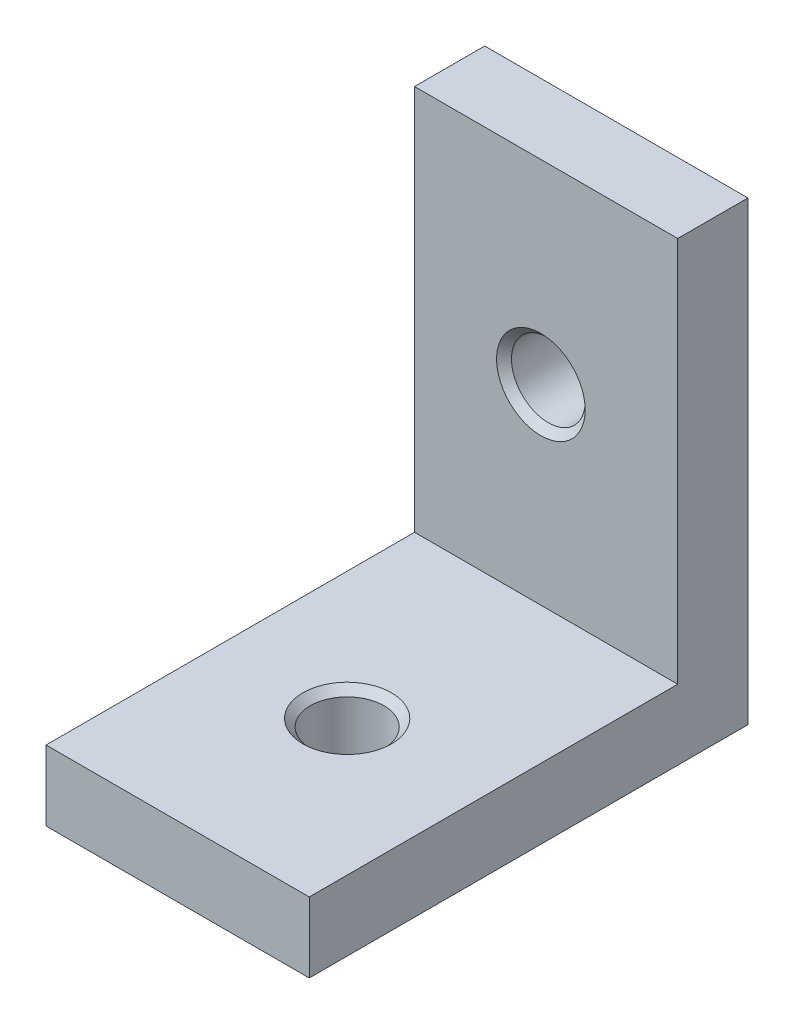
ISO-10303-21;
HEADER;
FILE_DESCRIPTION(('STEP AP214'),'2;1');
FILE_NAME('part.step','',(''),(''),'','','');
FILE_SCHEMA(('AUTOMOTIVE_DESIGN { 1 0 10303 214 1 1 1 1 }'));
ENDSEC;
DATA;
#1=APPLICATION_CONTEXT('core data for automotive mechanical design processes');
#2=APPLICATION_PROTOCOL_DEFINITION('international standard','automotive_design',2000,#1);
#3=PRODUCT_CONTEXT('',#1,'mechanical');
#4=PRODUCT('Part','Part','',(#3));
#5=PRODUCT_RELATED_PRODUCT_CATEGORY('part','',(#4));
#6=PRODUCT_DEFINITION_FORMATION('','',#4);
#7=PRODUCT_DEFINITION_CONTEXT('part definition',#1,'design');
#8=PRODUCT_DEFINITION('design','',#6,#7);
#9=PRODUCT_DEFINITION_SHAPE('','',#8);
#10=(LENGTH_UNIT() NAMED_UNIT(*) SI_UNIT(.MILLI.,.METRE.));
#11=(NAMED_UNIT(*) PLANE_ANGLE_UNIT() SI_UNIT($,.RADIAN.));
#12=(NAMED_UNIT(*) SI_UNIT($,.STERADIAN.) SOLID_ANGLE_UNIT());
#13=UNCERTAINTY_MEASURE_WITH_UNIT(LENGTH_MEASURE(1.E-05),#10,'distance_accuracy_value','');
#14=(GEOMETRIC_REPRESENTATION_CONTEXT(3) GLOBAL_UNCERTAINTY_ASSIGNED_CONTEXT((#13)) GLOBAL_UNIT_ASSIGNED_CONTEXT((#10,
#11,#12)) REPRESENTATION_CONTEXT('',''));
#15=CARTESIAN_POINT('',(0.,0.,0.));
#16=DIRECTION('',(0.,0.,1.));
#17=DIRECTION('',(1.,0.,0.));
#18=AXIS2_PLACEMENT_3D('',#15,#16,#17);
#19=CARTESIAN_POINT('',(-29.968152866242,4.,-12.6194267515924));
#20=DIRECTION('',(1.,0.,0.));
#21=DIRECTION('',(0.,0.,-1.));
#22=AXIS2_PLACEMENT_3D('',#19,#20,#21);
#23=PLANE('',#22);
#24=DIRECTION('',(0.,0.,1.));
#25=VECTOR('',#24,1.);
#26=CARTESIAN_POINT('',(-29.968152866242,0.,-12.6194267515924));
#27=LINE('',#26,#25);
#28=CARTESIAN_POINT('',(-29.968152866242,0.,-12.6194267515924));
#29=VERTEX_POINT('',#28);
#30=CARTESIAN_POINT('',(-29.968152866242,0.,12.3805732484076));
#31=VERTEX_POINT('',#30);
#32=EDGE_CURVE('E93',#29,#31,#27,.T.);
#33=ORIENTED_EDGE('',*,*,#32,.T.);
#34=DIRECTION('',(0.,-1.,0.));
#35=VECTOR('',#34,1.);
#36=CARTESIAN_POINT('',(-29.968152866242,4.,12.3805732484076));
#37=LINE('',#36,#35);
#38=CARTESIAN_POINT('',(-29.968152866242,4.,12.3805732484076));
#39=VERTEX_POINT('',#38);
#40=EDGE_CURVE('E11',#39,#31,#37,.T.);
#41=ORIENTED_EDGE('',*,*,#40,.F.);
#42=DIRECTION('',(0.,0.,1.));
#43=VECTOR('',#42,1.);
#44=CARTESIAN_POINT('',(-29.968152866242,4.,-12.6194267515924));
#45=LINE('',#44,#43);
#46=CARTESIAN_POINT('',(-29.968152866242,4.,-8.61942675159236));
#47=VERTEX_POINT('',#46);
#48=EDGE_CURVE('E86',#47,#39,#45,.T.);
#49=ORIENTED_EDGE('',*,*,#48,.F.);
#50=DIRECTION('',(0.,-1.,0.));
#51=VECTOR('',#50,1.);
#52=CARTESIAN_POINT('',(-29.968152866242,26.,-8.61942675159236));
#53=LINE('',#52,#51);
#54=CARTESIAN_POINT('',(-29.968152866242,26.,-8.61942675159236));
#55=VERTEX_POINT('',#54);
#56=EDGE_CURVE('E101',#55,#47,#53,.T.);
#57=ORIENTED_EDGE('',*,*,#56,.F.);
#58=DIRECTION('',(0.,0.,1.));
#59=VECTOR('',#58,1.);
#60=CARTESIAN_POINT('',(-29.968152866242,26.,-12.6194267515924));
#61=LINE('',#60,#59);
#62=CARTESIAN_POINT('',(-29.968152866242,26.,-12.6194267515924));
#63=VERTEX_POINT('',#62);
#64=EDGE_CURVE('E96',#63,#55,#61,.T.);
#65=ORIENTED_EDGE('',*,*,#64,.F.);
#66=DIRECTION('',(0.,-1.,0.));
#67=VECTOR('',#66,1.);
#68=CARTESIAN_POINT('',(-29.968152866242,4.,-12.6194267515924));
#69=LINE('',#68,#67);
#70=EDGE_CURVE('E79',#63,#29,#69,.T.);
#71=ORIENTED_EDGE('',*,*,#70,.T.);
#72=EDGE_LOOP('',(#33,#41,#49,#57,#65,#71));
#73=FACE_BOUND('',#72,.T.);
#74=ADVANCED_FACE('F35',(#73),#23,.F.);
#75=CARTESIAN_POINT('',(-29.968152866242,4.,12.3805732484076));
#76=DIRECTION('',(0.,0.,-1.));
#77=DIRECTION('',(-1.,0.,0.));
#78=AXIS2_PLACEMENT_3D('',#75,#76,#77);
#79=PLANE('',#78);
#80=DIRECTION('',(1.,0.,0.));
#81=VECTOR('',#80,1.);
#82=CARTESIAN_POINT('',(-29.968152866242,0.,12.3805732484076));
#83=LINE('',#82,#81);
#84=CARTESIAN_POINT('',(-14.968152866242,0.,12.3805732484076));
#85=VERTEX_POINT('',#84);
#86=EDGE_CURVE('E100',#31,#85,#83,.T.);
#87=ORIENTED_EDGE('',*,*,#86,.T.);
#88=DIRECTION('',(0.,-1.,0.));
#89=VECTOR('',#88,1.);
#90=CARTESIAN_POINT('',(-14.968152866242,4.,12.3805732484076));
#91=LINE('',#90,#89);
#92=CARTESIAN_POINT('',(-14.968152866242,4.,12.3805732484076));
#93=VERTEX_POINT('',#92);
#94=EDGE_CURVE('E42',#93,#85,#91,.T.);
#95=ORIENTED_EDGE('',*,*,#94,.F.);
#96=DIRECTION('',(1.,0.,0.));
#97=VECTOR('',#96,1.);
#98=CARTESIAN_POINT('',(-29.968152866242,4.,12.3805732484076));
#99=LINE('',#98,#97);
#100=EDGE_CURVE('E55',#39,#93,#99,.T.);
#101=ORIENTED_EDGE('',*,*,#100,.F.);
#102=ORIENTED_EDGE('',*,*,#40,.T.);
#103=EDGE_LOOP('',(#87,#95,#101,#102));
#104=FACE_BOUND('',#103,.T.);
#105=ADVANCED_FACE('F117',(#104),#79,.F.);
#106=CARTESIAN_POINT('',(-14.968152866242,4.,-12.6194267515924));
#107=DIRECTION('',(-1.,0.,0.));
#108=DIRECTION('',(0.,0.,1.));
#109=AXIS2_PLACEMENT_3D('',#106,#107,#108);
#110=PLANE('',#109);
#111=DIRECTION('',(0.,0.,-1.));
#112=VECTOR('',#111,1.);
#113=CARTESIAN_POINT('',(-14.968152866242,0.,-12.6194267515924));
#114=LINE('',#113,#112);
#115=CARTESIAN_POINT('',(-14.968152866242,0.,-12.6194267515924));
#116=VERTEX_POINT('',#115);
#117=EDGE_CURVE('E87',#85,#116,#114,.T.);
#118=ORIENTED_EDGE('',*,*,#117,.T.);
#119=DIRECTION('',(0.,-1.,0.));
#120=VECTOR('',#119,1.);
#121=CARTESIAN_POINT('',(-14.968152866242,4.,-12.6194267515924));
#122=LINE('',#121,#120);
#123=CARTESIAN_POINT('',(-14.968152866242,26.,-12.6194267515924));
#124=VERTEX_POINT('',#123);
#125=EDGE_CURVE('E82',#124,#116,#122,.T.);
#126=ORIENTED_EDGE('',*,*,#125,.F.);
#127=DIRECTION('',(0.,0.,-1.));
#128=VECTOR('',#127,1.);
#129=CARTESIAN_POINT('',(-14.968152866242,26.,-12.6194267515924));
#130=LINE('',#129,#128);
#131=CARTESIAN_POINT('',(-14.968152866242,26.,-8.61942675159236));
#132=VERTEX_POINT('',#131);
#133=EDGE_CURVE('E132',#132,#124,#130,.T.);
#134=ORIENTED_EDGE('',*,*,#133,.F.);
#135=DIRECTION('',(0.,-1.,0.));
#136=VECTOR('',#135,1.);
#137=CARTESIAN_POINT('',(-14.968152866242,26.,-8.61942675159236));
#138=LINE('',#137,#136);
#139=CARTESIAN_POINT('',(-14.968152866242,4.,-8.61942675159236));
#140=VERTEX_POINT('',#139);
#141=EDGE_CURVE('E105',#132,#140,#138,.T.);
#142=ORIENTED_EDGE('',*,*,#141,.T.);
#143=DIRECTION('',(0.,0.,-1.));
#144=VECTOR('',#143,1.);
#145=CARTESIAN_POINT('',(-14.968152866242,4.,-12.6194267515924));
#146=LINE('',#145,#144);
#147=EDGE_CURVE('E97',#93,#140,#146,.T.);
#148=ORIENTED_EDGE('',*,*,#147,.F.);
#149=ORIENTED_EDGE('',*,*,#94,.T.);
#150=EDGE_LOOP('',(#118,#126,#134,#142,#148,#149));
#151=FACE_BOUND('',#150,.T.);
#152=ADVANCED_FACE('F114',(#151),#110,.F.);
#153=CARTESIAN_POINT('',(-29.968152866242,4.,-12.6194267515924));
#154=DIRECTION('',(0.,0.,1.));
#155=DIRECTION('',(1.,0.,0.));
#156=AXIS2_PLACEMENT_3D('',#153,#154,#155);
#157=PLANE('',#156);
#158=CARTESIAN_POINT('',(-22.7683112302799,14.892355819702,-12.6194267515924));
#159=DIRECTION('',(0.,0.,1.));
#160=DIRECTION('',(1.,0.,0.));
#161=AXIS2_PLACEMENT_3D('',#158,#159,#160);
#162=CIRCLE('',#161,2.09999999999999);
#163=CARTESIAN_POINT('',(-20.6683112302799,14.892355819702,-12.6194267515924));
#164=VERTEX_POINT('',#163);
#165=EDGE_CURVE('E137',#164,#164,#162,.T.);
#166=ORIENTED_EDGE('',*,*,#165,.T.);
#167=EDGE_LOOP('',(#166));
#168=FACE_BOUND('',#167,.T.);
#169=DIRECTION('',(-1.,0.,0.));
#170=VECTOR('',#169,1.);
#171=CARTESIAN_POINT('',(-29.968152866242,0.,-12.6194267515924));
#172=LINE('',#171,#170);
#173=EDGE_CURVE('E75',#116,#29,#172,.T.);
#174=ORIENTED_EDGE('',*,*,#173,.T.);
#175=ORIENTED_EDGE('',*,*,#70,.F.);
#176=DIRECTION('',(-1.,0.,0.));
#177=VECTOR('',#176,1.);
#178=CARTESIAN_POINT('',(-29.968152866242,26.,-12.6194267515924));
#179=LINE('',#178,#177);
#180=EDGE_CURVE('E135',#124,#63,#179,.T.);
#181=ORIENTED_EDGE('',*,*,#180,.F.);
#182=ORIENTED_EDGE('',*,*,#125,.T.);
#183=EDGE_LOOP('',(#174,#175,#181,#182));
#184=FACE_BOUND('',#183,.T.);
#185=ADVANCED_FACE('F77',(#168,#184),#157,.F.);
#186=CARTESIAN_POINT('',(0.,4.,0.));
#187=DIRECTION('',(0.,1.,0.));
#188=DIRECTION('',(0.,0.,1.));
#189=AXIS2_PLACEMENT_3D('',#186,#187,#188);
#190=PLANE('',#189);
#191=CARTESIAN_POINT('',(-22.7034175758004,4.,2.48528967566102));
#192=DIRECTION('',(0.,1.,0.));
#193=DIRECTION('',(0.,0.,1.));
#194=AXIS2_PLACEMENT_3D('',#191,#192,#193);
#195=CIRCLE('',#194,2.525);
#196=CARTESIAN_POINT('',(-22.7034175758004,4.,5.01028967566102));
#197=VERTEX_POINT('',#196);
#198=EDGE_CURVE('E255',#197,#197,#195,.T.);
#199=ORIENTED_EDGE('',*,*,#198,.F.);
#200=EDGE_LOOP('',(#199));
#201=FACE_BOUND('',#200,.T.);
#202=DIRECTION('',(1.,0.,0.));
#203=VECTOR('',#202,1.);
#204=CARTESIAN_POINT('',(-29.968152866242,4.,-8.61942675159236));
#205=LINE('',#204,#203);
#206=EDGE_CURVE('E49',#47,#140,#205,.T.);
#207=ORIENTED_EDGE('',*,*,#206,.F.);
#208=ORIENTED_EDGE('',*,*,#48,.T.);
#209=ORIENTED_EDGE('',*,*,#100,.T.);
#210=ORIENTED_EDGE('',*,*,#147,.T.);
#211=EDGE_LOOP('',(#207,#208,#209,#210));
#212=FACE_BOUND('',#211,.T.);
#213=ADVANCED_FACE('F144',(#201,#212),#190,.T.);
#214=CARTESIAN_POINT('',(0.,0.,0.));
#215=DIRECTION('',(0.,1.,0.));
#216=DIRECTION('',(0.,0.,1.));
#217=AXIS2_PLACEMENT_3D('',#214,#215,#216);
#218=PLANE('',#217);
#219=CARTESIAN_POINT('',(-22.7034175758004,0.,2.48528967566102));
#220=DIRECTION('',(0.,1.,0.));
#221=DIRECTION('',(0.,0.,1.));
#222=AXIS2_PLACEMENT_3D('',#219,#220,#221);
#223=CIRCLE('',#222,2.09999999999999);
#224=CARTESIAN_POINT('',(-22.7034175758004,0.,4.58528967566101));
#225=VERTEX_POINT('',#224);
#226=EDGE_CURVE('E257',#225,#225,#223,.T.);
#227=ORIENTED_EDGE('',*,*,#226,.T.);
#228=EDGE_LOOP('',(#227));
#229=FACE_BOUND('',#228,.T.);
#230=ORIENTED_EDGE('',*,*,#32,.F.);
#231=ORIENTED_EDGE('',*,*,#173,.F.);
#232=ORIENTED_EDGE('',*,*,#117,.F.);
#233=ORIENTED_EDGE('',*,*,#86,.F.);
#234=EDGE_LOOP('',(#230,#231,#232,#233));
#235=FACE_BOUND('',#234,.T.);
#236=ADVANCED_FACE('F99',(#229,#235),#218,.F.);
#237=CARTESIAN_POINT('',(-29.968152866242,26.,-8.61942675159236));
#238=DIRECTION('',(0.,0.,-1.));
#239=DIRECTION('',(-1.,0.,0.));
#240=AXIS2_PLACEMENT_3D('',#237,#238,#239);
#241=PLANE('',#240);
#242=CARTESIAN_POINT('',(-22.7683112302799,14.892355819702,-8.61942675159236));
#243=DIRECTION('',(0.,0.,1.));
#244=DIRECTION('',(1.,0.,0.));
#245=AXIS2_PLACEMENT_3D('',#242,#243,#244);
#246=CIRCLE('',#245,2.525);
#247=CARTESIAN_POINT('',(-20.2433112302799,14.892355819702,-8.61942675159236));
#248=VERTEX_POINT('',#247);
#249=EDGE_CURVE('E262',#248,#248,#246,.T.);
#250=ORIENTED_EDGE('',*,*,#249,.F.);
#251=EDGE_LOOP('',(#250));
#252=FACE_BOUND('',#251,.T.);
#253=ORIENTED_EDGE('',*,*,#206,.T.);
#254=ORIENTED_EDGE('',*,*,#141,.F.);
#255=DIRECTION('',(1.,0.,0.));
#256=VECTOR('',#255,1.);
#257=CARTESIAN_POINT('',(-29.968152866242,26.,-8.61942675159236));
#258=LINE('',#257,#256);
#259=EDGE_CURVE('E126',#55,#132,#258,.T.);
#260=ORIENTED_EDGE('',*,*,#259,.F.);
#261=ORIENTED_EDGE('',*,*,#56,.T.);
#262=EDGE_LOOP('',(#253,#254,#260,#261));
#263=FACE_BOUND('',#262,.T.);
#264=ADVANCED_FACE('F122',(#252,#263),#241,.F.);
#265=CARTESIAN_POINT('',(0.,26.,0.));
#266=DIRECTION('',(0.,1.,0.));
#267=DIRECTION('',(0.,0.,1.));
#268=AXIS2_PLACEMENT_3D('',#265,#266,#267);
#269=PLANE('',#268);
#270=ORIENTED_EDGE('',*,*,#64,.T.);
#271=ORIENTED_EDGE('',*,*,#259,.T.);
#272=ORIENTED_EDGE('',*,*,#133,.T.);
#273=ORIENTED_EDGE('',*,*,#180,.T.);
#274=EDGE_LOOP('',(#270,#271,#272,#273));
#275=FACE_BOUND('',#274,.T.);
#276=ADVANCED_FACE('F134',(#275),#269,.T.);
#277=CARTESIAN_POINT('',(-22.7683112302799,14.892355819702,-8.61942675159236));
#278=DIRECTION('',(0.,0.,1.));
#279=DIRECTION('',(1.,0.,0.));
#280=AXIS2_PLACEMENT_3D('',#277,#278,#279);
#281=CYLINDRICAL_SURFACE('',#280,2.09999999999999);
#282=ORIENTED_EDGE('',*,*,#165,.F.);
#283=EDGE_LOOP('',(#282));
#284=FACE_BOUND('',#283,.T.);
#285=CARTESIAN_POINT('',(-22.7683112302799,14.892355819702,-9.04442675159236));
#286=DIRECTION('',(0.,0.,1.));
#287=DIRECTION('',(1.,0.,0.));
#288=AXIS2_PLACEMENT_3D('',#285,#286,#287);
#289=CIRCLE('',#288,2.1);
#290=CARTESIAN_POINT('',(-20.6683112302799,14.892355819702,-9.04442675159236));
#291=VERTEX_POINT('',#290);
#292=EDGE_CURVE('E264',#291,#291,#289,.T.);
#293=ORIENTED_EDGE('',*,*,#292,.T.);
#294=EDGE_LOOP('',(#293));
#295=FACE_BOUND('',#294,.T.);
#296=ADVANCED_FACE('F205',(#284,#295),#281,.F.);
#297=CARTESIAN_POINT('',(-22.7683112302799,14.892355819702,-8.61942675159236));
#298=DIRECTION('',(0.,0.,1.));
#299=DIRECTION('',(1.,0.,0.));
#300=AXIS2_PLACEMENT_3D('',#297,#298,#299);
#301=CONICAL_SURFACE('',#300,2.525,0.785398163397444);
#302=ORIENTED_EDGE('',*,*,#292,.F.);
#303=EDGE_LOOP('',(#302));
#304=FACE_BOUND('',#303,.T.);
#305=ORIENTED_EDGE('',*,*,#249,.T.);
#306=EDGE_LOOP('',(#305));
#307=FACE_BOUND('',#306,.T.);
#308=ADVANCED_FACE('F211',(#304,#307),#301,.F.);
#309=CARTESIAN_POINT('',(-22.7034175758004,4.,2.48528967566102));
#310=DIRECTION('',(0.,1.,0.));
#311=DIRECTION('',(0.,0.,1.));
#312=AXIS2_PLACEMENT_3D('',#309,#310,#311);
#313=CYLINDRICAL_SURFACE('',#312,2.09999999999999);
#314=ORIENTED_EDGE('',*,*,#226,.F.);
#315=EDGE_LOOP('',(#314));
#316=FACE_BOUND('',#315,.T.);
#317=CARTESIAN_POINT('',(-22.7034175758004,3.575,2.48528967566102));
#318=DIRECTION('',(0.,1.,0.));
#319=DIRECTION('',(0.,0.,1.));
#320=AXIS2_PLACEMENT_3D('',#317,#318,#319);
#321=CIRCLE('',#320,2.1);
#322=CARTESIAN_POINT('',(-22.7034175758004,3.575,4.58528967566102));
#323=VERTEX_POINT('',#322);
#324=EDGE_CURVE('E253',#323,#323,#321,.T.);
#325=ORIENTED_EDGE('',*,*,#324,.T.);
#326=EDGE_LOOP('',(#325));
#327=FACE_BOUND('',#326,.T.);
#328=ADVANCED_FACE('F222',(#316,#327),#313,.F.);
#329=CARTESIAN_POINT('',(-22.7034175758004,4.,2.48528967566102));
#330=DIRECTION('',(0.,1.,0.));
#331=DIRECTION('',(0.,0.,1.));
#332=AXIS2_PLACEMENT_3D('',#329,#330,#331);
#333=CONICAL_SURFACE('',#332,2.525,0.785398163397445);
#334=ORIENTED_EDGE('',*,*,#324,.F.);
#335=EDGE_LOOP('',(#334));
#336=FACE_BOUND('',#335,.T.);
#337=ORIENTED_EDGE('',*,*,#198,.T.);
#338=EDGE_LOOP('',(#337));
#339=FACE_BOUND('',#338,.T.);
#340=ADVANCED_FACE('F232',(#336,#339),#333,.F.);
#341=CLOSED_SHELL('',(#74,#105,#152,#185,#213,#236,#264,#276,#296,#308,#328,#340));
#342=MANIFOLD_SOLID_BREP('B2',#341);
#343=ADVANCED_BREP_SHAPE_REPRESENTATION('',(#18,#342),#14);
#344=SHAPE_DEFINITION_REPRESENTATION(#9,#343);
ENDSEC;
END-ISO-10303-21;
